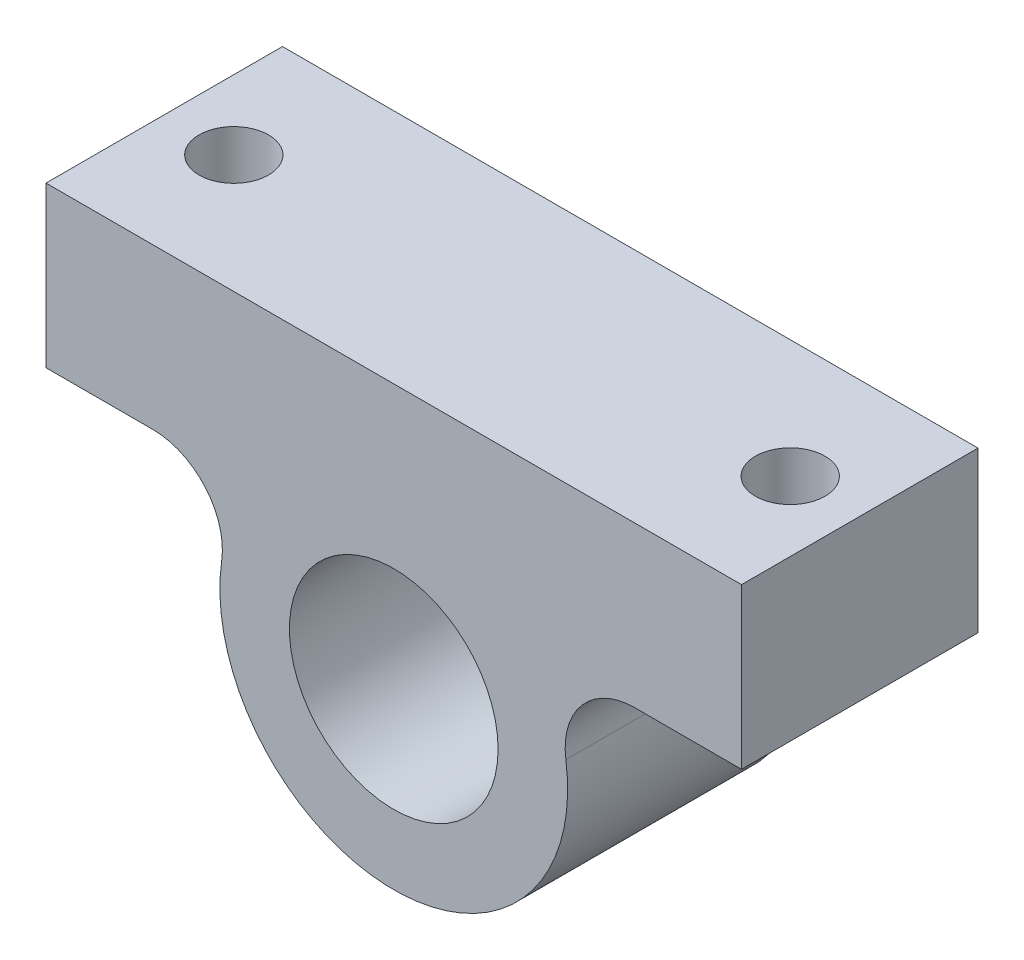
ISO-10303-21;
HEADER;
FILE_DESCRIPTION(('STEP AP214'),'2;1');
FILE_NAME('part.step','',(''),(''),'','','');
FILE_SCHEMA(('AUTOMOTIVE_DESIGN { 1 0 10303 214 1 1 1 1 }'));
ENDSEC;
DATA;
#1=APPLICATION_CONTEXT('core data for automotive mechanical design processes');
#2=APPLICATION_PROTOCOL_DEFINITION('international standard','automotive_design',2000,#1);
#3=PRODUCT_CONTEXT('',#1,'mechanical');
#4=PRODUCT('Part','Part','',(#3));
#5=PRODUCT_RELATED_PRODUCT_CATEGORY('part','',(#4));
#6=PRODUCT_DEFINITION_FORMATION('','',#4);
#7=PRODUCT_DEFINITION_CONTEXT('part definition',#1,'design');
#8=PRODUCT_DEFINITION('design','',#6,#7);
#9=PRODUCT_DEFINITION_SHAPE('','',#8);
#10=(LENGTH_UNIT() NAMED_UNIT(*) SI_UNIT(.MILLI.,.METRE.));
#11=(NAMED_UNIT(*) PLANE_ANGLE_UNIT() SI_UNIT($,.RADIAN.));
#12=(NAMED_UNIT(*) SI_UNIT($,.STERADIAN.) SOLID_ANGLE_UNIT());
#13=UNCERTAINTY_MEASURE_WITH_UNIT(LENGTH_MEASURE(1.E-05),#10,'distance_accuracy_value','');
#14=(GEOMETRIC_REPRESENTATION_CONTEXT(3) GLOBAL_UNCERTAINTY_ASSIGNED_CONTEXT((#13)) GLOBAL_UNIT_ASSIGNED_CONTEXT((#10,
#11,#12)) REPRESENTATION_CONTEXT('',''));
#15=CARTESIAN_POINT('',(0.,0.,0.));
#16=DIRECTION('',(0.,0.,1.));
#17=DIRECTION('',(1.,0.,0.));
#18=AXIS2_PLACEMENT_3D('',#15,#16,#17);
#19=CARTESIAN_POINT('',(0.,0.,17.));
#20=DIRECTION('',(0.,0.,1.));
#21=DIRECTION('',(1.,0.,0.));
#22=AXIS2_PLACEMENT_3D('',#19,#20,#21);
#23=PLANE('',#22);
#24=DIRECTION('',(1.,0.,0.));
#25=VECTOR('',#24,1.);
#26=CARTESIAN_POINT('',(-25.,7.5,17.));
#27=LINE('',#26,#25);
#28=CARTESIAN_POINT('',(-25.,7.5,17.));
#29=VERTEX_POINT('',#28);
#30=CARTESIAN_POINT('',(-17.3205080756888,7.5,17.));
#31=VERTEX_POINT('',#30);
#32=EDGE_CURVE('E143',#29,#31,#27,.T.);
#33=ORIENTED_EDGE('',*,*,#32,.T.);
#34=CARTESIAN_POINT('',(-17.3205080756888,2.5,17.));
#35=DIRECTION('',(0.,0.,1.));
#36=DIRECTION('',(1.,0.,0.));
#37=AXIS2_PLACEMENT_3D('',#34,#35,#36);
#38=CIRCLE('',#37,5.);
#39=CARTESIAN_POINT('',(-12.3717914826348,1.78571428571429,17.));
#40=VERTEX_POINT('',#39);
#41=EDGE_CURVE('E164',#31,#40,#38,.F.);
#42=ORIENTED_EDGE('',*,*,#41,.T.);
#43=CARTESIAN_POINT('',(0.,0.,17.));
#44=DIRECTION('',(0.,0.,1.));
#45=DIRECTION('',(1.,0.,0.));
#46=AXIS2_PLACEMENT_3D('',#43,#44,#45);
#47=CIRCLE('',#46,12.5);
#48=CARTESIAN_POINT('',(12.3717914826348,1.78571428571429,17.));
#49=VERTEX_POINT('',#48);
#50=EDGE_CURVE('E108',#40,#49,#47,.T.);
#51=ORIENTED_EDGE('',*,*,#50,.T.);
#52=CARTESIAN_POINT('',(17.3205080756888,2.5,17.));
#53=DIRECTION('',(0.,0.,1.));
#54=DIRECTION('',(1.,0.,0.));
#55=AXIS2_PLACEMENT_3D('',#52,#53,#54);
#56=CIRCLE('',#55,5.);
#57=CARTESIAN_POINT('',(17.3205080756888,7.5,17.));
#58=VERTEX_POINT('',#57);
#59=EDGE_CURVE('E11',#49,#58,#56,.F.);
#60=ORIENTED_EDGE('',*,*,#59,.T.);
#61=DIRECTION('',(1.,0.,0.));
#62=VECTOR('',#61,1.);
#63=CARTESIAN_POINT('',(25.,7.5,17.));
#64=LINE('',#63,#62);
#65=CARTESIAN_POINT('',(25.,7.5,17.));
#66=VERTEX_POINT('',#65);
#67=EDGE_CURVE('E97',#58,#66,#64,.T.);
#68=ORIENTED_EDGE('',*,*,#67,.T.);
#69=DIRECTION('',(0.,1.,0.));
#70=VECTOR('',#69,1.);
#71=CARTESIAN_POINT('',(25.,7.5,17.));
#72=LINE('',#71,#70);
#73=CARTESIAN_POINT('',(25.,19.,17.));
#74=VERTEX_POINT('',#73);
#75=EDGE_CURVE('E102',#66,#74,#72,.T.);
#76=ORIENTED_EDGE('',*,*,#75,.T.);
#77=DIRECTION('',(-1.,0.,0.));
#78=VECTOR('',#77,1.);
#79=CARTESIAN_POINT('',(-25.,19.,17.));
#80=LINE('',#79,#78);
#81=CARTESIAN_POINT('',(-25.,19.,17.));
#82=VERTEX_POINT('',#81);
#83=EDGE_CURVE('E122',#74,#82,#80,.T.);
#84=ORIENTED_EDGE('',*,*,#83,.T.);
#85=DIRECTION('',(0.,-1.,0.));
#86=VECTOR('',#85,1.);
#87=CARTESIAN_POINT('',(-25.,7.5,17.));
#88=LINE('',#87,#86);
#89=EDGE_CURVE('E124',#82,#29,#88,.T.);
#90=ORIENTED_EDGE('',*,*,#89,.T.);
#91=EDGE_LOOP('',(#33,#42,#51,#60,#68,#76,#84,#90));
#92=FACE_BOUND('',#91,.T.);
#93=CARTESIAN_POINT('',(0.,0.,17.));
#94=DIRECTION('',(0.,0.,1.));
#95=DIRECTION('',(1.,0.,0.));
#96=AXIS2_PLACEMENT_3D('',#93,#94,#95);
#97=CIRCLE('',#96,7.5);
#98=CARTESIAN_POINT('',(7.5,0.,17.));
#99=VERTEX_POINT('',#98);
#100=EDGE_CURVE('E134',#99,#99,#97,.T.);
#101=ORIENTED_EDGE('',*,*,#100,.F.);
#102=EDGE_LOOP('',(#101));
#103=FACE_BOUND('',#102,.T.);
#104=ADVANCED_FACE('F33',(#92,#103),#23,.T.);
#105=CARTESIAN_POINT('',(0.,0.,0.));
#106=DIRECTION('',(0.,0.,1.));
#107=DIRECTION('',(1.,0.,0.));
#108=AXIS2_PLACEMENT_3D('',#105,#106,#107);
#109=PLANE('',#108);
#110=DIRECTION('',(1.,0.,0.));
#111=VECTOR('',#110,1.);
#112=CARTESIAN_POINT('',(-25.,7.5,0.));
#113=LINE('',#112,#111);
#114=CARTESIAN_POINT('',(-25.,7.5,0.));
#115=VERTEX_POINT('',#114);
#116=CARTESIAN_POINT('',(-17.3205080756888,7.5,0.));
#117=VERTEX_POINT('',#116);
#118=EDGE_CURVE('E130',#115,#117,#113,.T.);
#119=ORIENTED_EDGE('',*,*,#118,.F.);
#120=DIRECTION('',(0.,-1.,0.));
#121=VECTOR('',#120,1.);
#122=CARTESIAN_POINT('',(-25.,7.5,0.));
#123=LINE('',#122,#121);
#124=CARTESIAN_POINT('',(-25.,19.,0.));
#125=VERTEX_POINT('',#124);
#126=EDGE_CURVE('E141',#125,#115,#123,.T.);
#127=ORIENTED_EDGE('',*,*,#126,.F.);
#128=DIRECTION('',(-1.,0.,0.));
#129=VECTOR('',#128,1.);
#130=CARTESIAN_POINT('',(-25.,19.,0.));
#131=LINE('',#130,#129);
#132=CARTESIAN_POINT('',(25.,19.,0.));
#133=VERTEX_POINT('',#132);
#134=EDGE_CURVE('E139',#133,#125,#131,.T.);
#135=ORIENTED_EDGE('',*,*,#134,.F.);
#136=DIRECTION('',(0.,1.,0.));
#137=VECTOR('',#136,1.);
#138=CARTESIAN_POINT('',(25.,7.5,0.));
#139=LINE('',#138,#137);
#140=CARTESIAN_POINT('',(25.,7.5,0.));
#141=VERTEX_POINT('',#140);
#142=EDGE_CURVE('E137',#141,#133,#139,.T.);
#143=ORIENTED_EDGE('',*,*,#142,.F.);
#144=DIRECTION('',(1.,0.,0.));
#145=VECTOR('',#144,1.);
#146=CARTESIAN_POINT('',(25.,7.5,0.));
#147=LINE('',#146,#145);
#148=CARTESIAN_POINT('',(17.3205080756888,7.5,0.));
#149=VERTEX_POINT('',#148);
#150=EDGE_CURVE('E113',#149,#141,#147,.T.);
#151=ORIENTED_EDGE('',*,*,#150,.F.);
#152=CARTESIAN_POINT('',(17.3205080756888,2.5,0.));
#153=DIRECTION('',(0.,0.,1.));
#154=DIRECTION('',(1.,0.,0.));
#155=AXIS2_PLACEMENT_3D('',#152,#153,#154);
#156=CIRCLE('',#155,5.);
#157=CARTESIAN_POINT('',(12.3717914826348,1.78571428571429,0.));
#158=VERTEX_POINT('',#157);
#159=EDGE_CURVE('E41',#149,#158,#156,.T.);
#160=ORIENTED_EDGE('',*,*,#159,.T.);
#161=CARTESIAN_POINT('',(0.,0.,0.));
#162=DIRECTION('',(0.,0.,1.));
#163=DIRECTION('',(1.,0.,0.));
#164=AXIS2_PLACEMENT_3D('',#161,#162,#163);
#165=CIRCLE('',#164,12.5);
#166=CARTESIAN_POINT('',(-12.3717914826348,1.78571428571429,0.));
#167=VERTEX_POINT('',#166);
#168=EDGE_CURVE('E133',#167,#158,#165,.T.);
#169=ORIENTED_EDGE('',*,*,#168,.F.);
#170=CARTESIAN_POINT('',(-17.3205080756888,2.5,0.));
#171=DIRECTION('',(0.,0.,1.));
#172=DIRECTION('',(1.,0.,0.));
#173=AXIS2_PLACEMENT_3D('',#170,#171,#172);
#174=CIRCLE('',#173,5.);
#175=EDGE_CURVE('E162',#167,#117,#174,.T.);
#176=ORIENTED_EDGE('',*,*,#175,.T.);
#177=EDGE_LOOP('',(#119,#127,#135,#143,#151,#160,#169,#176));
#178=FACE_BOUND('',#177,.T.);
#179=CARTESIAN_POINT('',(0.,0.,0.));
#180=DIRECTION('',(0.,0.,1.));
#181=DIRECTION('',(1.,0.,0.));
#182=AXIS2_PLACEMENT_3D('',#179,#180,#181);
#183=CIRCLE('',#182,7.5);
#184=CARTESIAN_POINT('',(7.5,0.,0.));
#185=VERTEX_POINT('',#184);
#186=EDGE_CURVE('E157',#185,#185,#183,.T.);
#187=ORIENTED_EDGE('',*,*,#186,.T.);
#188=EDGE_LOOP('',(#187));
#189=FACE_BOUND('',#188,.T.);
#190=ADVANCED_FACE('F170',(#178,#189),#109,.F.);
#191=CARTESIAN_POINT('',(-25.,7.5,17.));
#192=DIRECTION('',(0.,1.,0.));
#193=DIRECTION('',(0.,0.,1.));
#194=AXIS2_PLACEMENT_3D('',#191,#192,#193);
#195=PLANE('',#194);
#196=CARTESIAN_POINT('',(-20.,7.5,8.5));
#197=DIRECTION('',(0.,1.,0.));
#198=DIRECTION('',(0.,0.,1.));
#199=AXIS2_PLACEMENT_3D('',#196,#197,#198);
#200=CIRCLE('',#199,2.50000000000001);
#201=CARTESIAN_POINT('',(-20.,7.5,5.99999999999999));
#202=VERTEX_POINT('',#201);
#203=EDGE_CURVE('E192',#202,#202,#200,.F.);
#204=ORIENTED_EDGE('',*,*,#203,.F.);
#205=EDGE_LOOP('',(#204));
#206=FACE_BOUND('',#205,.T.);
#207=ORIENTED_EDGE('',*,*,#118,.T.);
#208=DIRECTION('',(0.,0.,1.));
#209=VECTOR('',#208,1.);
#210=CARTESIAN_POINT('',(-17.3205080756888,7.5,17.));
#211=LINE('',#210,#209);
#212=EDGE_CURVE('E160',#117,#31,#211,.T.);
#213=ORIENTED_EDGE('',*,*,#212,.T.);
#214=ORIENTED_EDGE('',*,*,#32,.F.);
#215=DIRECTION('',(0.,0.,-1.));
#216=VECTOR('',#215,1.);
#217=CARTESIAN_POINT('',(-25.,7.5,17.));
#218=LINE('',#217,#216);
#219=EDGE_CURVE('E129',#29,#115,#218,.T.);
#220=ORIENTED_EDGE('',*,*,#219,.T.);
#221=EDGE_LOOP('',(#207,#213,#214,#220));
#222=FACE_BOUND('',#221,.T.);
#223=ADVANCED_FACE('F184',(#206,#222),#195,.F.);
#224=CARTESIAN_POINT('',(0.,0.,17.));
#225=DIRECTION('',(0.,0.,-1.));
#226=DIRECTION('',(-1.,0.,0.));
#227=AXIS2_PLACEMENT_3D('',#224,#225,#226);
#228=CYLINDRICAL_SURFACE('',#227,12.5);
#229=ORIENTED_EDGE('',*,*,#168,.T.);
#230=DIRECTION('',(0.,0.,-1.));
#231=VECTOR('',#230,1.);
#232=CARTESIAN_POINT('',(12.3717914826348,1.78571428571429,17.));
#233=LINE('',#232,#231);
#234=EDGE_CURVE('E54',#158,#49,#233,.F.);
#235=ORIENTED_EDGE('',*,*,#234,.T.);
#236=ORIENTED_EDGE('',*,*,#50,.F.);
#237=DIRECTION('',(0.,0.,-1.));
#238=VECTOR('',#237,1.);
#239=CARTESIAN_POINT('',(-12.3717914826348,1.78571428571429,17.));
#240=LINE('',#239,#238);
#241=EDGE_CURVE('E116',#40,#167,#240,.T.);
#242=ORIENTED_EDGE('',*,*,#241,.T.);
#243=EDGE_LOOP('',(#229,#235,#236,#242));
#244=FACE_BOUND('',#243,.T.);
#245=ADVANCED_FACE('F202',(#244),#228,.T.);
#246=CARTESIAN_POINT('',(25.,7.5,17.));
#247=DIRECTION('',(0.,1.,0.));
#248=DIRECTION('',(0.,0.,1.));
#249=AXIS2_PLACEMENT_3D('',#246,#247,#248);
#250=PLANE('',#249);
#251=CARTESIAN_POINT('',(20.,7.5,8.5));
#252=DIRECTION('',(0.,1.,0.));
#253=DIRECTION('',(0.,0.,1.));
#254=AXIS2_PLACEMENT_3D('',#251,#252,#253);
#255=CIRCLE('',#254,2.5);
#256=CARTESIAN_POINT('',(20.,7.5,6.));
#257=VERTEX_POINT('',#256);
#258=EDGE_CURVE('E154',#257,#257,#255,.F.);
#259=ORIENTED_EDGE('',*,*,#258,.F.);
#260=EDGE_LOOP('',(#259));
#261=FACE_BOUND('',#260,.T.);
#262=ORIENTED_EDGE('',*,*,#67,.F.);
#263=DIRECTION('',(0.,0.,1.));
#264=VECTOR('',#263,1.);
#265=CARTESIAN_POINT('',(17.3205080756888,7.5,0.));
#266=LINE('',#265,#264);
#267=EDGE_CURVE('E166',#58,#149,#266,.F.);
#268=ORIENTED_EDGE('',*,*,#267,.T.);
#269=ORIENTED_EDGE('',*,*,#150,.T.);
#270=DIRECTION('',(0.,0.,-1.));
#271=VECTOR('',#270,1.);
#272=CARTESIAN_POINT('',(25.,7.5,17.));
#273=LINE('',#272,#271);
#274=EDGE_CURVE('E111',#66,#141,#273,.T.);
#275=ORIENTED_EDGE('',*,*,#274,.F.);
#276=EDGE_LOOP('',(#262,#268,#269,#275));
#277=FACE_BOUND('',#276,.T.);
#278=ADVANCED_FACE('F112',(#261,#277),#250,.F.);
#279=CARTESIAN_POINT('',(25.,7.5,17.));
#280=DIRECTION('',(-1.,0.,0.));
#281=DIRECTION('',(0.,0.,1.));
#282=AXIS2_PLACEMENT_3D('',#279,#280,#281);
#283=PLANE('',#282);
#284=ORIENTED_EDGE('',*,*,#142,.T.);
#285=DIRECTION('',(0.,0.,-1.));
#286=VECTOR('',#285,1.);
#287=CARTESIAN_POINT('',(25.,19.,17.));
#288=LINE('',#287,#286);
#289=EDGE_CURVE('E117',#74,#133,#288,.T.);
#290=ORIENTED_EDGE('',*,*,#289,.F.);
#291=ORIENTED_EDGE('',*,*,#75,.F.);
#292=ORIENTED_EDGE('',*,*,#274,.T.);
#293=EDGE_LOOP('',(#284,#290,#291,#292));
#294=FACE_BOUND('',#293,.T.);
#295=ADVANCED_FACE('F119',(#294),#283,.F.);
#296=CARTESIAN_POINT('',(-25.,19.,17.));
#297=DIRECTION('',(0.,-1.,0.));
#298=DIRECTION('',(0.,0.,-1.));
#299=AXIS2_PLACEMENT_3D('',#296,#297,#298);
#300=PLANE('',#299);
#301=CARTESIAN_POINT('',(20.,19.,8.5));
#302=DIRECTION('',(0.,-1.,0.));
#303=DIRECTION('',(0.,0.,-1.));
#304=AXIS2_PLACEMENT_3D('',#301,#302,#303);
#305=CIRCLE('',#304,2.5);
#306=CARTESIAN_POINT('',(20.,19.,6.));
#307=VERTEX_POINT('',#306);
#308=EDGE_CURVE('E153',#307,#307,#305,.F.);
#309=ORIENTED_EDGE('',*,*,#308,.F.);
#310=EDGE_LOOP('',(#309));
#311=FACE_BOUND('',#310,.T.);
#312=CARTESIAN_POINT('',(-20.,19.,8.5));
#313=DIRECTION('',(0.,-1.,0.));
#314=DIRECTION('',(0.,0.,-1.));
#315=AXIS2_PLACEMENT_3D('',#312,#313,#314);
#316=CIRCLE('',#315,2.50000000000001);
#317=CARTESIAN_POINT('',(-20.,19.,5.99999999999999));
#318=VERTEX_POINT('',#317);
#319=EDGE_CURVE('E150',#318,#318,#316,.F.);
#320=ORIENTED_EDGE('',*,*,#319,.F.);
#321=EDGE_LOOP('',(#320));
#322=FACE_BOUND('',#321,.T.);
#323=ORIENTED_EDGE('',*,*,#134,.T.);
#324=DIRECTION('',(0.,0.,-1.));
#325=VECTOR('',#324,1.);
#326=CARTESIAN_POINT('',(-25.,19.,17.));
#327=LINE('',#326,#325);
#328=EDGE_CURVE('E146',#82,#125,#327,.T.);
#329=ORIENTED_EDGE('',*,*,#328,.F.);
#330=ORIENTED_EDGE('',*,*,#83,.F.);
#331=ORIENTED_EDGE('',*,*,#289,.T.);
#332=EDGE_LOOP('',(#323,#329,#330,#331));
#333=FACE_BOUND('',#332,.T.);
#334=ADVANCED_FACE('F175',(#311,#322,#333),#300,.F.);
#335=CARTESIAN_POINT('',(-25.,7.5,17.));
#336=DIRECTION('',(1.,0.,0.));
#337=DIRECTION('',(0.,0.,-1.));
#338=AXIS2_PLACEMENT_3D('',#335,#336,#337);
#339=PLANE('',#338);
#340=ORIENTED_EDGE('',*,*,#126,.T.);
#341=ORIENTED_EDGE('',*,*,#219,.F.);
#342=ORIENTED_EDGE('',*,*,#89,.F.);
#343=ORIENTED_EDGE('',*,*,#328,.T.);
#344=EDGE_LOOP('',(#340,#341,#342,#343));
#345=FACE_BOUND('',#344,.T.);
#346=ADVANCED_FACE('F182',(#345),#339,.F.);
#347=CARTESIAN_POINT('',(0.,0.,17.));
#348=DIRECTION('',(0.,0.,-1.));
#349=DIRECTION('',(-1.,0.,0.));
#350=AXIS2_PLACEMENT_3D('',#347,#348,#349);
#351=CYLINDRICAL_SURFACE('',#350,7.5);
#352=ORIENTED_EDGE('',*,*,#100,.T.);
#353=EDGE_LOOP('',(#352));
#354=FACE_BOUND('',#353,.T.);
#355=ORIENTED_EDGE('',*,*,#186,.F.);
#356=EDGE_LOOP('',(#355));
#357=FACE_BOUND('',#356,.T.);
#358=ADVANCED_FACE('F217',(#354,#357),#351,.F.);
#359=CARTESIAN_POINT('',(-20.,19.000012,8.5));
#360=DIRECTION('',(0.,-1.,0.));
#361=DIRECTION('',(0.,0.,-1.));
#362=AXIS2_PLACEMENT_3D('',#359,#360,#361);
#363=CYLINDRICAL_SURFACE('',#362,2.50000000000001);
#364=CARTESIAN_POINT('',(-20.,7.5,5.99999999999999));
#365=CARTESIAN_POINT('',(-20.,7.61979166666666,5.99999999999999));
#366=CARTESIAN_POINT('',(-20.,7.73958333333333,5.99999999999999));
#367=CARTESIAN_POINT('',(-20.,7.97916666666667,5.99999999999999));
#368=CARTESIAN_POINT('',(-20.,8.09895833333333,5.99999999999999));
#369=CARTESIAN_POINT('',(-20.,8.33854166666667,5.99999999999999));
#370=CARTESIAN_POINT('',(-20.,8.45833333333333,5.99999999999999));
#371=CARTESIAN_POINT('',(-20.,8.69791666666667,5.99999999999999));
#372=CARTESIAN_POINT('',(-20.,8.81770833333333,5.99999999999999));
#373=CARTESIAN_POINT('',(-20.,9.05729166666667,5.99999999999999));
#374=CARTESIAN_POINT('',(-20.,9.17708333333333,5.99999999999999));
#375=CARTESIAN_POINT('',(-20.,9.41666666666667,5.99999999999999));
#376=CARTESIAN_POINT('',(-20.,9.53645833333333,5.99999999999999));
#377=CARTESIAN_POINT('',(-20.,9.77604166666667,5.99999999999999));
#378=CARTESIAN_POINT('',(-20.,9.89583333333333,5.99999999999999));
#379=CARTESIAN_POINT('',(-20.,10.1354166666667,5.99999999999999));
#380=CARTESIAN_POINT('',(-20.,10.2552083333333,5.99999999999999));
#381=CARTESIAN_POINT('',(-20.,10.4947916666667,5.99999999999999));
#382=CARTESIAN_POINT('',(-20.,10.6145833333333,5.99999999999999));
#383=CARTESIAN_POINT('',(-20.,10.8541666666667,5.99999999999999));
#384=CARTESIAN_POINT('',(-20.,10.9739583333333,5.99999999999999));
#385=CARTESIAN_POINT('',(-20.,11.2135416666667,5.99999999999999));
#386=CARTESIAN_POINT('',(-20.,11.3333333333333,5.99999999999999));
#387=CARTESIAN_POINT('',(-20.,11.5729166666667,5.99999999999999));
#388=CARTESIAN_POINT('',(-20.,11.6927083333333,5.99999999999999));
#389=CARTESIAN_POINT('',(-20.,11.9322916666667,5.99999999999999));
#390=CARTESIAN_POINT('',(-20.,12.0520833333333,5.99999999999999));
#391=CARTESIAN_POINT('',(-20.,12.2916666666667,5.99999999999999));
#392=CARTESIAN_POINT('',(-20.,12.4114583333333,5.99999999999999));
#393=CARTESIAN_POINT('',(-20.,12.6510416666667,5.99999999999999));
#394=CARTESIAN_POINT('',(-20.,12.7708333333333,5.99999999999999));
#395=CARTESIAN_POINT('',(-20.,13.0104166666667,5.99999999999999));
#396=CARTESIAN_POINT('',(-20.,13.1302083333333,5.99999999999999));
#397=CARTESIAN_POINT('',(-20.,13.3697916666667,5.99999999999999));
#398=CARTESIAN_POINT('',(-20.,13.4895833333333,5.99999999999999));
#399=CARTESIAN_POINT('',(-20.,13.7291666666667,5.99999999999999));
#400=CARTESIAN_POINT('',(-20.,13.8489583333333,5.99999999999999));
#401=CARTESIAN_POINT('',(-20.,14.0885416666667,5.99999999999999));
#402=CARTESIAN_POINT('',(-20.,14.2083333333333,5.99999999999999));
#403=CARTESIAN_POINT('',(-20.,14.4479166666667,5.99999999999999));
#404=CARTESIAN_POINT('',(-20.,14.5677083333333,5.99999999999999));
#405=CARTESIAN_POINT('',(-20.,14.8072916666667,5.99999999999999));
#406=CARTESIAN_POINT('',(-20.,14.9270833333333,5.99999999999999));
#407=CARTESIAN_POINT('',(-20.,15.1666666666667,5.99999999999999));
#408=CARTESIAN_POINT('',(-20.,15.2864583333333,5.99999999999999));
#409=CARTESIAN_POINT('',(-20.,15.5260416666667,5.99999999999999));
#410=CARTESIAN_POINT('',(-20.,15.6458333333333,5.99999999999999));
#411=CARTESIAN_POINT('',(-20.,15.8854166666667,5.99999999999999));
#412=CARTESIAN_POINT('',(-20.,16.0052083333333,5.99999999999999));
#413=CARTESIAN_POINT('',(-20.,16.2447916666667,5.99999999999999));
#414=CARTESIAN_POINT('',(-20.,16.3645833333333,5.99999999999999));
#415=CARTESIAN_POINT('',(-20.,16.6041666666667,5.99999999999999));
#416=CARTESIAN_POINT('',(-20.,16.7239583333333,5.99999999999999));
#417=CARTESIAN_POINT('',(-20.,16.9635416666667,5.99999999999999));
#418=CARTESIAN_POINT('',(-20.,17.0833333333333,5.99999999999999));
#419=CARTESIAN_POINT('',(-20.,17.3229166666667,5.99999999999999));
#420=CARTESIAN_POINT('',(-20.,17.4427083333333,5.99999999999999));
#421=CARTESIAN_POINT('',(-20.,17.6822916666667,5.99999999999999));
#422=CARTESIAN_POINT('',(-20.,17.8020833333333,5.99999999999999));
#423=CARTESIAN_POINT('',(-20.,18.0416666666667,5.99999999999999));
#424=CARTESIAN_POINT('',(-20.,18.1614583333334,5.99999999999999));
#425=CARTESIAN_POINT('',(-20.,18.4010416666667,5.99999999999999));
#426=CARTESIAN_POINT('',(-20.,18.5208333333333,5.99999999999999));
#427=CARTESIAN_POINT('',(-20.,18.7604166666667,5.99999999999999));
#428=CARTESIAN_POINT('',(-20.,18.8802083333334,5.99999999999999));
#429=CARTESIAN_POINT('',(-20.,19.,5.99999999999999));
#430=B_SPLINE_CURVE_WITH_KNOTS('',3,(#364,#365,#366,#367,#368,#369,#370,#371,#372,#373,#374,
#375,#376,#377,#378,#379,#380,#381,#382,#383,#384,#385,#386,#387,#388,#389,#390,#391,#392,#393,
#394,#395,#396,#397,#398,#399,#400,#401,#402,#403,#404,#405,#406,#407,#408,#409,#410,#411,#412,
#413,#414,#415,#416,#417,#418,#419,#420,#421,#422,#423,#424,#425,#426,#427,#428,#429),
.UNSPECIFIED.,.F.,.F.,(4,2,2,2,2,2,2,2,2,2,2,2,2,2,2,2,2,2,2,2,2,2,2,2,2,2,2,2,2,2,2,2,4),(0.,
0.359375,0.718750000000001,1.078125,1.4375,1.796875,2.15625,2.515625,2.87500000000001,
3.23437500000001,3.59375000000001,3.95312500000001,4.31250000000001,4.67187500000001,
5.03125000000001,5.39062500000001,5.75000000000001,6.10937500000001,6.46875000000001,
6.82812500000001,7.18750000000001,7.54687500000001,7.90625000000001,8.26562500000001,
8.62500000000002,8.98437500000001,9.34375000000002,9.70312500000002,10.0625,10.421875,10.78125,
11.140625,11.5),.UNSPECIFIED.);
#431=EDGE_CURVE('BSEAM230',#202,#318,#430,.T.);
#432=ORIENTED_EDGE('',*,*,#203,.T.);
#433=ORIENTED_EDGE('',*,*,#319,.T.);
#434=ORIENTED_EDGE('',*,*,#431,.T.);
#435=ORIENTED_EDGE('',*,*,#431,.F.);
#436=EDGE_LOOP('',(#432,#434,#433,#435));
#437=FACE_BOUND('',#436,.T.);
#438=ADVANCED_FACE('F230',(#437),#363,.F.);
#439=CARTESIAN_POINT('',(20.,19.000012,8.5));
#440=DIRECTION('',(0.,-1.,0.));
#441=DIRECTION('',(0.,0.,-1.));
#442=AXIS2_PLACEMENT_3D('',#439,#440,#441);
#443=CYLINDRICAL_SURFACE('',#442,2.5);
#444=CARTESIAN_POINT('',(20.,7.5,6.));
#445=CARTESIAN_POINT('',(20.,7.61979166666666,6.));
#446=CARTESIAN_POINT('',(20.,7.73958333333333,6.));
#447=CARTESIAN_POINT('',(20.,7.97916666666667,6.));
#448=CARTESIAN_POINT('',(20.,8.09895833333333,6.));
#449=CARTESIAN_POINT('',(20.,8.33854166666667,6.));
#450=CARTESIAN_POINT('',(20.,8.45833333333333,6.));
#451=CARTESIAN_POINT('',(20.,8.69791666666667,6.));
#452=CARTESIAN_POINT('',(20.,8.81770833333333,6.));
#453=CARTESIAN_POINT('',(20.,9.05729166666667,6.));
#454=CARTESIAN_POINT('',(20.,9.17708333333333,6.));
#455=CARTESIAN_POINT('',(20.,9.41666666666667,6.));
#456=CARTESIAN_POINT('',(20.,9.53645833333333,6.));
#457=CARTESIAN_POINT('',(20.,9.77604166666667,6.));
#458=CARTESIAN_POINT('',(20.,9.89583333333333,6.));
#459=CARTESIAN_POINT('',(20.,10.1354166666667,6.));
#460=CARTESIAN_POINT('',(20.,10.2552083333333,6.));
#461=CARTESIAN_POINT('',(20.,10.4947916666667,6.));
#462=CARTESIAN_POINT('',(20.,10.6145833333333,6.));
#463=CARTESIAN_POINT('',(20.,10.8541666666667,6.));
#464=CARTESIAN_POINT('',(20.,10.9739583333333,6.));
#465=CARTESIAN_POINT('',(20.,11.2135416666667,6.));
#466=CARTESIAN_POINT('',(20.,11.3333333333333,6.));
#467=CARTESIAN_POINT('',(20.,11.5729166666667,6.));
#468=CARTESIAN_POINT('',(20.,11.6927083333333,6.));
#469=CARTESIAN_POINT('',(20.,11.9322916666667,6.));
#470=CARTESIAN_POINT('',(20.,12.0520833333333,6.));
#471=CARTESIAN_POINT('',(20.,12.2916666666667,6.));
#472=CARTESIAN_POINT('',(20.,12.4114583333333,6.));
#473=CARTESIAN_POINT('',(20.,12.6510416666667,6.));
#474=CARTESIAN_POINT('',(20.,12.7708333333333,6.));
#475=CARTESIAN_POINT('',(20.,13.0104166666667,6.));
#476=CARTESIAN_POINT('',(20.,13.1302083333333,6.));
#477=CARTESIAN_POINT('',(20.,13.3697916666667,6.));
#478=CARTESIAN_POINT('',(20.,13.4895833333333,6.));
#479=CARTESIAN_POINT('',(20.,13.7291666666667,6.));
#480=CARTESIAN_POINT('',(20.,13.8489583333333,6.));
#481=CARTESIAN_POINT('',(20.,14.0885416666667,6.));
#482=CARTESIAN_POINT('',(20.,14.2083333333333,6.));
#483=CARTESIAN_POINT('',(20.,14.4479166666667,6.));
#484=CARTESIAN_POINT('',(20.,14.5677083333333,6.));
#485=CARTESIAN_POINT('',(20.,14.8072916666667,6.));
#486=CARTESIAN_POINT('',(20.,14.9270833333333,6.));
#487=CARTESIAN_POINT('',(20.,15.1666666666667,6.));
#488=CARTESIAN_POINT('',(20.,15.2864583333333,6.));
#489=CARTESIAN_POINT('',(20.,15.5260416666667,6.));
#490=CARTESIAN_POINT('',(20.,15.6458333333333,6.));
#491=CARTESIAN_POINT('',(20.,15.8854166666667,6.));
#492=CARTESIAN_POINT('',(20.,16.0052083333333,6.));
#493=CARTESIAN_POINT('',(20.,16.2447916666667,6.));
#494=CARTESIAN_POINT('',(20.,16.3645833333333,6.));
#495=CARTESIAN_POINT('',(20.,16.6041666666667,6.));
#496=CARTESIAN_POINT('',(20.,16.7239583333333,6.));
#497=CARTESIAN_POINT('',(20.,16.9635416666667,6.));
#498=CARTESIAN_POINT('',(20.,17.0833333333333,6.));
#499=CARTESIAN_POINT('',(20.,17.3229166666667,6.));
#500=CARTESIAN_POINT('',(20.,17.4427083333333,6.));
#501=CARTESIAN_POINT('',(20.,17.6822916666667,6.));
#502=CARTESIAN_POINT('',(20.,17.8020833333333,6.));
#503=CARTESIAN_POINT('',(20.,18.0416666666667,6.));
#504=CARTESIAN_POINT('',(20.,18.1614583333334,6.));
#505=CARTESIAN_POINT('',(20.,18.4010416666667,6.));
#506=CARTESIAN_POINT('',(20.,18.5208333333333,6.));
#507=CARTESIAN_POINT('',(20.,18.7604166666667,6.));
#508=CARTESIAN_POINT('',(20.,18.8802083333334,6.));
#509=CARTESIAN_POINT('',(20.,19.,6.));
#510=B_SPLINE_CURVE_WITH_KNOTS('',3,(#444,#445,#446,#447,#448,#449,#450,#451,#452,#453,#454,
#455,#456,#457,#458,#459,#460,#461,#462,#463,#464,#465,#466,#467,#468,#469,#470,#471,#472,#473,
#474,#475,#476,#477,#478,#479,#480,#481,#482,#483,#484,#485,#486,#487,#488,#489,#490,#491,#492,
#493,#494,#495,#496,#497,#498,#499,#500,#501,#502,#503,#504,#505,#506,#507,#508,#509),
.UNSPECIFIED.,.F.,.F.,(4,2,2,2,2,2,2,2,2,2,2,2,2,2,2,2,2,2,2,2,2,2,2,2,2,2,2,2,2,2,2,2,4),(0.,
0.359375,0.718750000000001,1.078125,1.4375,1.796875,2.15625,2.515625,2.87500000000001,
3.23437500000001,3.59375000000001,3.95312500000001,4.31250000000001,4.67187500000001,
5.03125000000001,5.39062500000001,5.75000000000001,6.10937500000001,6.46875000000001,
6.82812500000001,7.18750000000001,7.54687500000001,7.90625000000001,8.26562500000001,
8.62500000000002,8.98437500000001,9.34375000000002,9.70312500000002,10.0625,10.421875,10.78125,
11.140625,11.5),.UNSPECIFIED.);
#511=EDGE_CURVE('BSEAM198',#257,#307,#510,.T.);
#512=ORIENTED_EDGE('',*,*,#258,.T.);
#513=ORIENTED_EDGE('',*,*,#308,.T.);
#514=ORIENTED_EDGE('',*,*,#511,.T.);
#515=ORIENTED_EDGE('',*,*,#511,.F.);
#516=EDGE_LOOP('',(#512,#514,#513,#515));
#517=FACE_BOUND('',#516,.T.);
#518=ADVANCED_FACE('F198',(#517),#443,.F.);
#519=CARTESIAN_POINT('',(-17.3205080756888,2.5,17.));
#520=DIRECTION('',(0.,0.,-1.));
#521=DIRECTION('',(-1.,0.,0.));
#522=AXIS2_PLACEMENT_3D('',#519,#520,#521);
#523=CYLINDRICAL_SURFACE('',#522,5.);
#524=ORIENTED_EDGE('',*,*,#41,.F.);
#525=ORIENTED_EDGE('',*,*,#212,.F.);
#526=ORIENTED_EDGE('',*,*,#175,.F.);
#527=ORIENTED_EDGE('',*,*,#241,.F.);
#528=EDGE_LOOP('',(#524,#525,#526,#527));
#529=FACE_BOUND('',#528,.T.);
#530=ADVANCED_FACE('F237',(#529),#523,.F.);
#531=CARTESIAN_POINT('',(17.3205080756888,2.5,17.));
#532=DIRECTION('',(0.,0.,-1.));
#533=DIRECTION('',(-1.,0.,0.));
#534=AXIS2_PLACEMENT_3D('',#531,#532,#533);
#535=CYLINDRICAL_SURFACE('',#534,5.);
#536=ORIENTED_EDGE('',*,*,#59,.F.);
#537=ORIENTED_EDGE('',*,*,#234,.F.);
#538=ORIENTED_EDGE('',*,*,#159,.F.);
#539=ORIENTED_EDGE('',*,*,#267,.F.);
#540=EDGE_LOOP('',(#536,#537,#538,#539));
#541=FACE_BOUND('',#540,.T.);
#542=ADVANCED_FACE('F35',(#541),#535,.F.);
#543=CLOSED_SHELL('',(#104,#190,#223,#245,#278,#295,#334,#346,#358,#438,#518,#530,#542));
#544=MANIFOLD_SOLID_BREP('B2',#543);
#545=ADVANCED_BREP_SHAPE_REPRESENTATION('',(#18,#544),#14);
#546=SHAPE_DEFINITION_REPRESENTATION(#9,#545);
ENDSEC;
END-ISO-10303-21;
